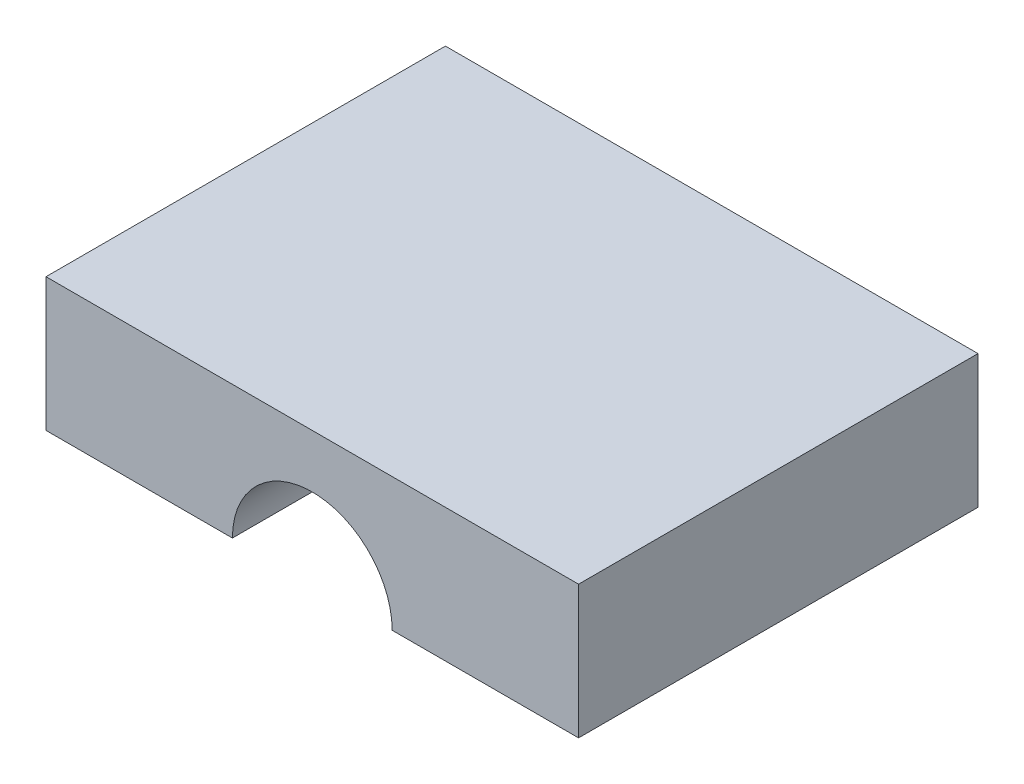
ISO-10303-21;
HEADER;
FILE_DESCRIPTION(('STEP AP214'),'2;1');
FILE_NAME('part.step','',(''),(''),'','','');
FILE_SCHEMA(('AUTOMOTIVE_DESIGN { 1 0 10303 214 1 1 1 1 }'));
ENDSEC;
DATA;
#1=APPLICATION_CONTEXT('core data for automotive mechanical design processes');
#2=APPLICATION_PROTOCOL_DEFINITION('international standard','automotive_design',2000,#1);
#3=PRODUCT_CONTEXT('',#1,'mechanical');
#4=PRODUCT('Part','Part','',(#3));
#5=PRODUCT_RELATED_PRODUCT_CATEGORY('part','',(#4));
#6=PRODUCT_DEFINITION_FORMATION('','',#4);
#7=PRODUCT_DEFINITION_CONTEXT('part definition',#1,'design');
#8=PRODUCT_DEFINITION('design','',#6,#7);
#9=PRODUCT_DEFINITION_SHAPE('','',#8);
#10=(LENGTH_UNIT() NAMED_UNIT(*) SI_UNIT(.MILLI.,.METRE.));
#11=(NAMED_UNIT(*) PLANE_ANGLE_UNIT() SI_UNIT($,.RADIAN.));
#12=(NAMED_UNIT(*) SI_UNIT($,.STERADIAN.) SOLID_ANGLE_UNIT());
#13=UNCERTAINTY_MEASURE_WITH_UNIT(LENGTH_MEASURE(1.E-05),#10,'distance_accuracy_value','');
#14=(GEOMETRIC_REPRESENTATION_CONTEXT(3) GLOBAL_UNCERTAINTY_ASSIGNED_CONTEXT((#13)) GLOBAL_UNIT_ASSIGNED_CONTEXT((#10,
#11,#12)) REPRESENTATION_CONTEXT('',''));
#15=CARTESIAN_POINT('',(0.,0.,0.));
#16=DIRECTION('',(0.,0.,1.));
#17=DIRECTION('',(1.,0.,0.));
#18=AXIS2_PLACEMENT_3D('',#15,#16,#17);
#19=CARTESIAN_POINT('',(0.,0.,0.));
#20=DIRECTION('',(0.,-1.,0.));
#21=DIRECTION('',(0.,0.,1.));
#22=AXIS2_PLACEMENT_3D('',#19,#20,#21);
#23=PLANE('',#22);
#24=DIRECTION('',(0.,0.,-1.));
#25=VECTOR('',#24,1.);
#26=CARTESIAN_POINT('',(26.,0.,30.));
#27=LINE('',#26,#25);
#28=CARTESIAN_POINT('',(26.,0.,30.));
#29=VERTEX_POINT('',#28);
#30=CARTESIAN_POINT('',(26.,0.,0.));
#31=VERTEX_POINT('',#30);
#32=EDGE_CURVE('E105',#29,#31,#27,.T.);
#33=ORIENTED_EDGE('',*,*,#32,.T.);
#34=DIRECTION('',(1.,0.,0.));
#35=VECTOR('',#34,1.);
#36=CARTESIAN_POINT('',(0.,0.,0.));
#37=LINE('',#36,#35);
#38=CARTESIAN_POINT('',(40.,0.,0.));
#39=VERTEX_POINT('',#38);
#40=EDGE_CURVE('E135',#31,#39,#37,.T.);
#41=ORIENTED_EDGE('',*,*,#40,.T.);
#42=DIRECTION('',(0.,0.,1.));
#43=VECTOR('',#42,1.);
#44=CARTESIAN_POINT('',(40.,0.,0.));
#45=LINE('',#44,#43);
#46=CARTESIAN_POINT('',(40.,0.,30.));
#47=VERTEX_POINT('',#46);
#48=EDGE_CURVE('E120',#39,#47,#45,.T.);
#49=ORIENTED_EDGE('',*,*,#48,.T.);
#50=DIRECTION('',(-1.,0.,0.));
#51=VECTOR('',#50,1.);
#52=CARTESIAN_POINT('',(0.,0.,30.));
#53=LINE('',#52,#51);
#54=EDGE_CURVE('E119',#47,#29,#53,.T.);
#55=ORIENTED_EDGE('',*,*,#54,.T.);
#56=EDGE_LOOP('',(#33,#41,#49,#55));
#57=FACE_BOUND('',#56,.T.);
#58=ADVANCED_FACE('F43',(#57),#23,.T.);
#59=CARTESIAN_POINT('',(0.,10.,0.));
#60=DIRECTION('',(1.,0.,0.));
#61=DIRECTION('',(0.,0.,1.));
#62=AXIS2_PLACEMENT_3D('',#59,#60,#61);
#63=PLANE('',#62);
#64=DIRECTION('',(0.,0.,-1.));
#65=VECTOR('',#64,1.);
#66=CARTESIAN_POINT('',(0.,0.,0.));
#67=LINE('',#66,#65);
#68=CARTESIAN_POINT('',(0.,0.,30.));
#69=VERTEX_POINT('',#68);
#70=CARTESIAN_POINT('',(0.,0.,0.));
#71=VERTEX_POINT('',#70);
#72=EDGE_CURVE('E140',#69,#71,#67,.T.);
#73=ORIENTED_EDGE('',*,*,#72,.F.);
#74=DIRECTION('',(0.,-1.,0.));
#75=VECTOR('',#74,1.);
#76=CARTESIAN_POINT('',(0.,10.,30.));
#77=LINE('',#76,#75);
#78=CARTESIAN_POINT('',(0.,10.,30.));
#79=VERTEX_POINT('',#78);
#80=EDGE_CURVE('E117',#79,#69,#77,.T.);
#81=ORIENTED_EDGE('',*,*,#80,.F.);
#82=DIRECTION('',(0.,0.,-1.));
#83=VECTOR('',#82,1.);
#84=CARTESIAN_POINT('',(0.,10.,0.));
#85=LINE('',#84,#83);
#86=CARTESIAN_POINT('',(0.,10.,0.));
#87=VERTEX_POINT('',#86);
#88=EDGE_CURVE('E122',#79,#87,#85,.T.);
#89=ORIENTED_EDGE('',*,*,#88,.T.);
#90=DIRECTION('',(0.,-1.,0.));
#91=VECTOR('',#90,1.);
#92=CARTESIAN_POINT('',(0.,10.,0.));
#93=LINE('',#92,#91);
#94=EDGE_CURVE('E11',#87,#71,#93,.T.);
#95=ORIENTED_EDGE('',*,*,#94,.T.);
#96=EDGE_LOOP('',(#73,#81,#89,#95));
#97=FACE_BOUND('',#96,.T.);
#98=ADVANCED_FACE('F45',(#97),#63,.F.);
#99=CARTESIAN_POINT('',(0.,10.,0.));
#100=DIRECTION('',(0.,0.,1.));
#101=DIRECTION('',(-1.,0.,0.));
#102=AXIS2_PLACEMENT_3D('',#99,#100,#101);
#103=PLANE('',#102);
#104=CARTESIAN_POINT('',(14.,0.,0.));
#105=VERTEX_POINT('',#104);
#106=EDGE_CURVE('E104',#71,#105,#37,.T.);
#107=ORIENTED_EDGE('',*,*,#106,.F.);
#108=ORIENTED_EDGE('',*,*,#94,.F.);
#109=DIRECTION('',(1.,0.,0.));
#110=VECTOR('',#109,1.);
#111=CARTESIAN_POINT('',(0.,10.,0.));
#112=LINE('',#111,#110);
#113=CARTESIAN_POINT('',(40.,10.,0.));
#114=VERTEX_POINT('',#113);
#115=EDGE_CURVE('E94',#87,#114,#112,.T.);
#116=ORIENTED_EDGE('',*,*,#115,.T.);
#117=DIRECTION('',(0.,-1.,0.));
#118=VECTOR('',#117,1.);
#119=CARTESIAN_POINT('',(40.,10.,0.));
#120=LINE('',#119,#118);
#121=EDGE_CURVE('E51',#114,#39,#120,.T.);
#122=ORIENTED_EDGE('',*,*,#121,.T.);
#123=ORIENTED_EDGE('',*,*,#40,.F.);
#124=CARTESIAN_POINT('',(20.,0.,0.));
#125=DIRECTION('',(0.,0.,1.));
#126=DIRECTION('',(-1.,0.,0.));
#127=AXIS2_PLACEMENT_3D('',#124,#125,#126);
#128=CIRCLE('',#127,6.);
#129=EDGE_CURVE('E113',#31,#105,#128,.T.);
#130=ORIENTED_EDGE('',*,*,#129,.T.);
#131=EDGE_LOOP('',(#107,#108,#116,#122,#123,#130));
#132=FACE_BOUND('',#131,.T.);
#133=ADVANCED_FACE('F133',(#132),#103,.F.);
#134=CARTESIAN_POINT('',(40.,10.,0.));
#135=DIRECTION('',(-1.,0.,0.));
#136=DIRECTION('',(0.,0.,-1.));
#137=AXIS2_PLACEMENT_3D('',#134,#135,#136);
#138=PLANE('',#137);
#139=ORIENTED_EDGE('',*,*,#48,.F.);
#140=ORIENTED_EDGE('',*,*,#121,.F.);
#141=DIRECTION('',(0.,0.,1.));
#142=VECTOR('',#141,1.);
#143=CARTESIAN_POINT('',(40.,10.,0.));
#144=LINE('',#143,#142);
#145=CARTESIAN_POINT('',(40.,10.,30.));
#146=VERTEX_POINT('',#145);
#147=EDGE_CURVE('E144',#114,#146,#144,.T.);
#148=ORIENTED_EDGE('',*,*,#147,.T.);
#149=DIRECTION('',(0.,-1.,0.));
#150=VECTOR('',#149,1.);
#151=CARTESIAN_POINT('',(40.,10.,30.));
#152=LINE('',#151,#150);
#153=EDGE_CURVE('E128',#146,#47,#152,.T.);
#154=ORIENTED_EDGE('',*,*,#153,.T.);
#155=EDGE_LOOP('',(#139,#140,#148,#154));
#156=FACE_BOUND('',#155,.T.);
#157=ADVANCED_FACE('F138',(#156),#138,.F.);
#158=CARTESIAN_POINT('',(0.,10.,30.));
#159=DIRECTION('',(0.,0.,-1.));
#160=DIRECTION('',(1.,0.,0.));
#161=AXIS2_PLACEMENT_3D('',#158,#159,#160);
#162=PLANE('',#161);
#163=ORIENTED_EDGE('',*,*,#54,.F.);
#164=ORIENTED_EDGE('',*,*,#153,.F.);
#165=DIRECTION('',(-1.,0.,0.));
#166=VECTOR('',#165,1.);
#167=CARTESIAN_POINT('',(0.,10.,30.));
#168=LINE('',#167,#166);
#169=EDGE_CURVE('E67',#146,#79,#168,.T.);
#170=ORIENTED_EDGE('',*,*,#169,.T.);
#171=ORIENTED_EDGE('',*,*,#80,.T.);
#172=CARTESIAN_POINT('',(14.,0.,30.));
#173=VERTEX_POINT('',#172);
#174=EDGE_CURVE('E88',#173,#69,#53,.T.);
#175=ORIENTED_EDGE('',*,*,#174,.F.);
#176=CARTESIAN_POINT('',(20.,0.,30.));
#177=DIRECTION('',(0.,0.,1.));
#178=DIRECTION('',(-1.,0.,0.));
#179=AXIS2_PLACEMENT_3D('',#176,#177,#178);
#180=CIRCLE('',#179,6.);
#181=EDGE_CURVE('E106',#29,#173,#180,.T.);
#182=ORIENTED_EDGE('',*,*,#181,.F.);
#183=EDGE_LOOP('',(#163,#164,#170,#171,#175,#182));
#184=FACE_BOUND('',#183,.T.);
#185=ADVANCED_FACE('F115',(#184),#162,.F.);
#186=CARTESIAN_POINT('',(0.,10.,0.));
#187=DIRECTION('',(0.,-1.,0.));
#188=DIRECTION('',(0.,0.,1.));
#189=AXIS2_PLACEMENT_3D('',#186,#187,#188);
#190=PLANE('',#189);
#191=ORIENTED_EDGE('',*,*,#88,.F.);
#192=ORIENTED_EDGE('',*,*,#169,.F.);
#193=ORIENTED_EDGE('',*,*,#147,.F.);
#194=ORIENTED_EDGE('',*,*,#115,.F.);
#195=EDGE_LOOP('',(#191,#192,#193,#194));
#196=FACE_BOUND('',#195,.T.);
#197=ADVANCED_FACE('F151',(#196),#190,.F.);
#198=DIRECTION('',(0.,0.,-1.));
#199=VECTOR('',#198,1.);
#200=CARTESIAN_POINT('',(14.,0.,30.));
#201=LINE('',#200,#199);
#202=EDGE_CURVE('E58',#173,#105,#201,.T.);
#203=ORIENTED_EDGE('',*,*,#202,.F.);
#204=ORIENTED_EDGE('',*,*,#174,.T.);
#205=ORIENTED_EDGE('',*,*,#72,.T.);
#206=ORIENTED_EDGE('',*,*,#106,.T.);
#207=EDGE_LOOP('',(#203,#204,#205,#206));
#208=FACE_BOUND('',#207,.T.);
#209=ADVANCED_FACE('F103',(#208),#23,.T.);
#210=CARTESIAN_POINT('',(20.,0.,30.));
#211=DIRECTION('',(0.,0.,-1.));
#212=DIRECTION('',(1.,0.,0.));
#213=AXIS2_PLACEMENT_3D('',#210,#211,#212);
#214=CYLINDRICAL_SURFACE('',#213,6.);
#215=ORIENTED_EDGE('',*,*,#129,.F.);
#216=ORIENTED_EDGE('',*,*,#32,.F.);
#217=ORIENTED_EDGE('',*,*,#181,.T.);
#218=ORIENTED_EDGE('',*,*,#202,.T.);
#219=EDGE_LOOP('',(#215,#216,#217,#218));
#220=FACE_BOUND('',#219,.T.);
#221=ADVANCED_FACE('F109',(#220),#214,.F.);
#222=CLOSED_SHELL('',(#58,#98,#133,#157,#185,#197,#209,#221));
#223=MANIFOLD_SOLID_BREP('B2',#222);
#224=ADVANCED_BREP_SHAPE_REPRESENTATION('',(#18,#223),#14);
#225=SHAPE_DEFINITION_REPRESENTATION(#9,#224);
ENDSEC;
END-ISO-10303-21;
